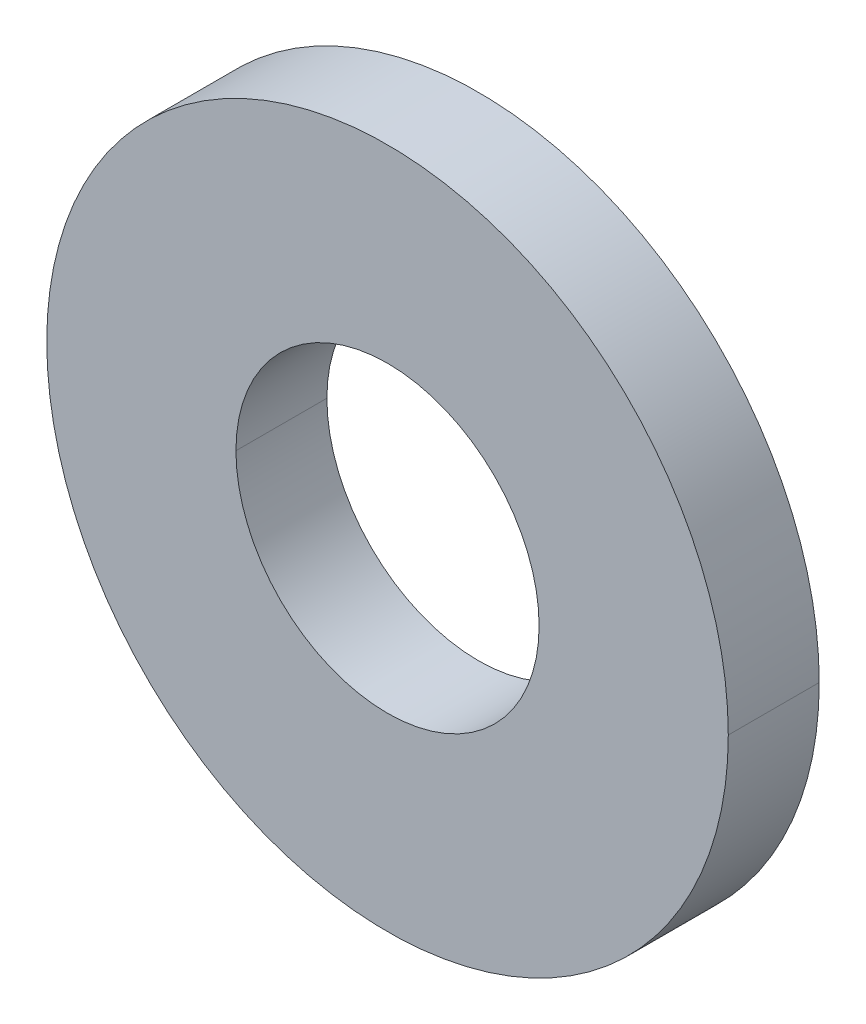
ISO-10303-21;
HEADER;
FILE_DESCRIPTION(('STEP AP214'),'2;1');
FILE_NAME('part.step','',(''),(''),'','','');
FILE_SCHEMA(('AUTOMOTIVE_DESIGN { 1 0 10303 214 1 1 1 1 }'));
ENDSEC;
DATA;
#1=APPLICATION_CONTEXT('core data for automotive mechanical design processes');
#2=APPLICATION_PROTOCOL_DEFINITION('international standard','automotive_design',2000,#1);
#3=PRODUCT_CONTEXT('',#1,'mechanical');
#4=PRODUCT('Part','Part','',(#3));
#5=PRODUCT_RELATED_PRODUCT_CATEGORY('part','',(#4));
#6=PRODUCT_DEFINITION_FORMATION('','',#4);
#7=PRODUCT_DEFINITION_CONTEXT('part definition',#1,'design');
#8=PRODUCT_DEFINITION('design','',#6,#7);
#9=PRODUCT_DEFINITION_SHAPE('','',#8);
#10=(LENGTH_UNIT() NAMED_UNIT(*) SI_UNIT(.MILLI.,.METRE.));
#11=(NAMED_UNIT(*) PLANE_ANGLE_UNIT() SI_UNIT($,.RADIAN.));
#12=(NAMED_UNIT(*) SI_UNIT($,.STERADIAN.) SOLID_ANGLE_UNIT());
#13=UNCERTAINTY_MEASURE_WITH_UNIT(LENGTH_MEASURE(1.E-05),#10,'distance_accuracy_value','');
#14=(GEOMETRIC_REPRESENTATION_CONTEXT(3) GLOBAL_UNCERTAINTY_ASSIGNED_CONTEXT((#13)) GLOBAL_UNIT_ASSIGNED_CONTEXT((#10,
#11,#12)) REPRESENTATION_CONTEXT('',''));
#15=CARTESIAN_POINT('',(0.,0.,0.));
#16=DIRECTION('',(0.,0.,1.));
#17=DIRECTION('',(1.,0.,0.));
#18=AXIS2_PLACEMENT_3D('',#15,#16,#17);
#19=CARTESIAN_POINT('',(0.,7.1374,0.));
#20=DIRECTION('',(0.,0.,1.));
#21=DIRECTION('',(1.,0.,0.));
#22=AXIS2_PLACEMENT_3D('',#19,#20,#21);
#23=PLANE('',#22);
#24=CARTESIAN_POINT('',(0.,0.,0.));
#25=DIRECTION('',(0.,0.,-1.));
#26=DIRECTION('',(-1.,0.,0.));
#27=AXIS2_PLACEMENT_3D('',#24,#25,#26);
#28=CIRCLE('',#27,3.175);
#29=CARTESIAN_POINT('',(-3.175,0.,0.));
#30=VERTEX_POINT('',#29);
#31=CARTESIAN_POINT('',(3.175,0.,0.));
#32=VERTEX_POINT('',#31);
#33=EDGE_CURVE('E11',#30,#32,#28,.T.);
#34=ORIENTED_EDGE('',*,*,#33,.T.);
#35=CARTESIAN_POINT('',(0.,0.,0.));
#36=DIRECTION('',(0.,0.,-1.));
#37=DIRECTION('',(-1.,0.,0.));
#38=AXIS2_PLACEMENT_3D('',#35,#36,#37);
#39=CIRCLE('',#38,3.175);
#40=EDGE_CURVE('E24',#32,#30,#39,.T.);
#41=ORIENTED_EDGE('',*,*,#40,.T.);
#42=EDGE_LOOP('',(#34,#41));
#43=FACE_BOUND('',#42,.T.);
#44=CARTESIAN_POINT('',(0.,0.,0.));
#45=DIRECTION('',(0.,0.,-1.));
#46=DIRECTION('',(-1.,0.,0.));
#47=AXIS2_PLACEMENT_3D('',#44,#45,#46);
#48=CIRCLE('',#47,7.1374);
#49=CARTESIAN_POINT('',(7.1374,0.,0.));
#50=VERTEX_POINT('',#49);
#51=CARTESIAN_POINT('',(-7.1374,0.,0.));
#52=VERTEX_POINT('',#51);
#53=EDGE_CURVE('E94',#50,#52,#48,.T.);
#54=ORIENTED_EDGE('',*,*,#53,.F.);
#55=CARTESIAN_POINT('',(0.,0.,0.));
#56=DIRECTION('',(0.,0.,-1.));
#57=DIRECTION('',(-1.,0.,0.));
#58=AXIS2_PLACEMENT_3D('',#55,#56,#57);
#59=CIRCLE('',#58,7.1374);
#60=EDGE_CURVE('E89',#52,#50,#59,.T.);
#61=ORIENTED_EDGE('',*,*,#60,.F.);
#62=EDGE_LOOP('',(#54,#61));
#63=FACE_BOUND('',#62,.T.);
#64=ADVANCED_FACE('F16',(#43,#63),#23,.T.);
#65=CARTESIAN_POINT('',(0.,0.,-1.905));
#66=DIRECTION('',(0.,0.,-1.));
#67=DIRECTION('',(0.,-1.,0.));
#68=AXIS2_PLACEMENT_3D('',#65,#66,#67);
#69=CYLINDRICAL_SURFACE('',#68,7.1374);
#70=DIRECTION('',(0.,0.,-1.));
#71=VECTOR('',#70,1.);
#72=CARTESIAN_POINT('',(7.1374,0.,0.));
#73=LINE('',#72,#71);
#74=CARTESIAN_POINT('',(7.1374,0.,-1.905));
#75=VERTEX_POINT('',#74);
#76=EDGE_CURVE('E85',#50,#75,#73,.T.);
#77=ORIENTED_EDGE('',*,*,#76,.T.);
#78=CARTESIAN_POINT('',(0.,0.,-1.905));
#79=DIRECTION('',(0.,0.,-1.));
#80=DIRECTION('',(-1.,0.,0.));
#81=AXIS2_PLACEMENT_3D('',#78,#79,#80);
#82=CIRCLE('',#81,7.1374);
#83=CARTESIAN_POINT('',(-7.1374,0.,-1.905));
#84=VERTEX_POINT('',#83);
#85=EDGE_CURVE('E80',#84,#75,#82,.T.);
#86=ORIENTED_EDGE('',*,*,#85,.F.);
#87=DIRECTION('',(0.,0.,-1.));
#88=VECTOR('',#87,1.);
#89=CARTESIAN_POINT('',(-7.1374,0.,0.));
#90=LINE('',#89,#88);
#91=EDGE_CURVE('E69',#52,#84,#90,.T.);
#92=ORIENTED_EDGE('',*,*,#91,.F.);
#93=ORIENTED_EDGE('',*,*,#60,.T.);
#94=EDGE_LOOP('',(#77,#86,#92,#93));
#95=FACE_BOUND('',#94,.T.);
#96=ADVANCED_FACE('F110',(#95),#69,.T.);
#97=CARTESIAN_POINT('',(0.,0.,-1.905));
#98=DIRECTION('',(0.,0.,-1.));
#99=DIRECTION('',(0.,1.,0.));
#100=AXIS2_PLACEMENT_3D('',#97,#98,#99);
#101=CYLINDRICAL_SURFACE('',#100,7.1374);
#102=ORIENTED_EDGE('',*,*,#76,.F.);
#103=ORIENTED_EDGE('',*,*,#53,.T.);
#104=ORIENTED_EDGE('',*,*,#91,.T.);
#105=CARTESIAN_POINT('',(0.,0.,-1.905));
#106=DIRECTION('',(0.,0.,-1.));
#107=DIRECTION('',(-1.,0.,0.));
#108=AXIS2_PLACEMENT_3D('',#105,#106,#107);
#109=CIRCLE('',#108,7.1374);
#110=EDGE_CURVE('E66',#75,#84,#109,.T.);
#111=ORIENTED_EDGE('',*,*,#110,.F.);
#112=EDGE_LOOP('',(#102,#103,#104,#111));
#113=FACE_BOUND('',#112,.T.);
#114=ADVANCED_FACE('F105',(#113),#101,.T.);
#115=CARTESIAN_POINT('',(0.,3.175,-1.905));
#116=DIRECTION('',(0.,0.,-1.));
#117=DIRECTION('',(-1.,0.,0.));
#118=AXIS2_PLACEMENT_3D('',#115,#116,#117);
#119=PLANE('',#118);
#120=ORIENTED_EDGE('',*,*,#85,.T.);
#121=ORIENTED_EDGE('',*,*,#110,.T.);
#122=EDGE_LOOP('',(#120,#121));
#123=FACE_BOUND('',#122,.T.);
#124=CARTESIAN_POINT('',(0.,0.,-1.905));
#125=DIRECTION('',(0.,0.,-1.));
#126=DIRECTION('',(-1.,0.,0.));
#127=AXIS2_PLACEMENT_3D('',#124,#125,#126);
#128=CIRCLE('',#127,3.175);
#129=CARTESIAN_POINT('',(3.175,0.,-1.905));
#130=VERTEX_POINT('',#129);
#131=CARTESIAN_POINT('',(-3.175,0.,-1.905));
#132=VERTEX_POINT('',#131);
#133=EDGE_CURVE('E54',#130,#132,#128,.T.);
#134=ORIENTED_EDGE('',*,*,#133,.F.);
#135=CARTESIAN_POINT('',(0.,0.,-1.905));
#136=DIRECTION('',(0.,0.,-1.));
#137=DIRECTION('',(-1.,0.,0.));
#138=AXIS2_PLACEMENT_3D('',#135,#136,#137);
#139=CIRCLE('',#138,3.175);
#140=EDGE_CURVE('E50',#132,#130,#139,.T.);
#141=ORIENTED_EDGE('',*,*,#140,.F.);
#142=EDGE_LOOP('',(#134,#141));
#143=FACE_BOUND('',#142,.T.);
#144=ADVANCED_FACE('F52',(#123,#143),#119,.T.);
#145=CARTESIAN_POINT('',(0.,0.,-1.905));
#146=DIRECTION('',(0.,0.,-1.));
#147=DIRECTION('',(0.,-1.,0.));
#148=AXIS2_PLACEMENT_3D('',#145,#146,#147);
#149=CYLINDRICAL_SURFACE('',#148,3.175);
#150=DIRECTION('',(0.,0.,-1.));
#151=VECTOR('',#150,1.);
#152=CARTESIAN_POINT('',(3.175,0.,0.));
#153=LINE('',#152,#151);
#154=EDGE_CURVE('E58',#32,#130,#153,.T.);
#155=ORIENTED_EDGE('',*,*,#154,.F.);
#156=ORIENTED_EDGE('',*,*,#33,.F.);
#157=DIRECTION('',(0.,0.,-1.));
#158=VECTOR('',#157,1.);
#159=CARTESIAN_POINT('',(-3.175,0.,0.));
#160=LINE('',#159,#158);
#161=EDGE_CURVE('E61',#30,#132,#160,.T.);
#162=ORIENTED_EDGE('',*,*,#161,.T.);
#163=ORIENTED_EDGE('',*,*,#140,.T.);
#164=EDGE_LOOP('',(#155,#156,#162,#163));
#165=FACE_BOUND('',#164,.T.);
#166=ADVANCED_FACE('F62',(#165),#149,.F.);
#167=CARTESIAN_POINT('',(0.,0.,-1.905));
#168=DIRECTION('',(0.,0.,-1.));
#169=DIRECTION('',(0.,1.,0.));
#170=AXIS2_PLACEMENT_3D('',#167,#168,#169);
#171=CYLINDRICAL_SURFACE('',#170,3.175);
#172=ORIENTED_EDGE('',*,*,#154,.T.);
#173=ORIENTED_EDGE('',*,*,#133,.T.);
#174=ORIENTED_EDGE('',*,*,#161,.F.);
#175=ORIENTED_EDGE('',*,*,#40,.F.);
#176=EDGE_LOOP('',(#172,#173,#174,#175));
#177=FACE_BOUND('',#176,.T.);
#178=ADVANCED_FACE('F65',(#177),#171,.F.);
#179=CLOSED_SHELL('',(#64,#96,#114,#144,#166,#178));
#180=MANIFOLD_SOLID_BREP('B1',#179);
#181=ADVANCED_BREP_SHAPE_REPRESENTATION('',(#18,#180),#14);
#182=SHAPE_DEFINITION_REPRESENTATION(#9,#181);
ENDSEC;
END-ISO-10303-21;
